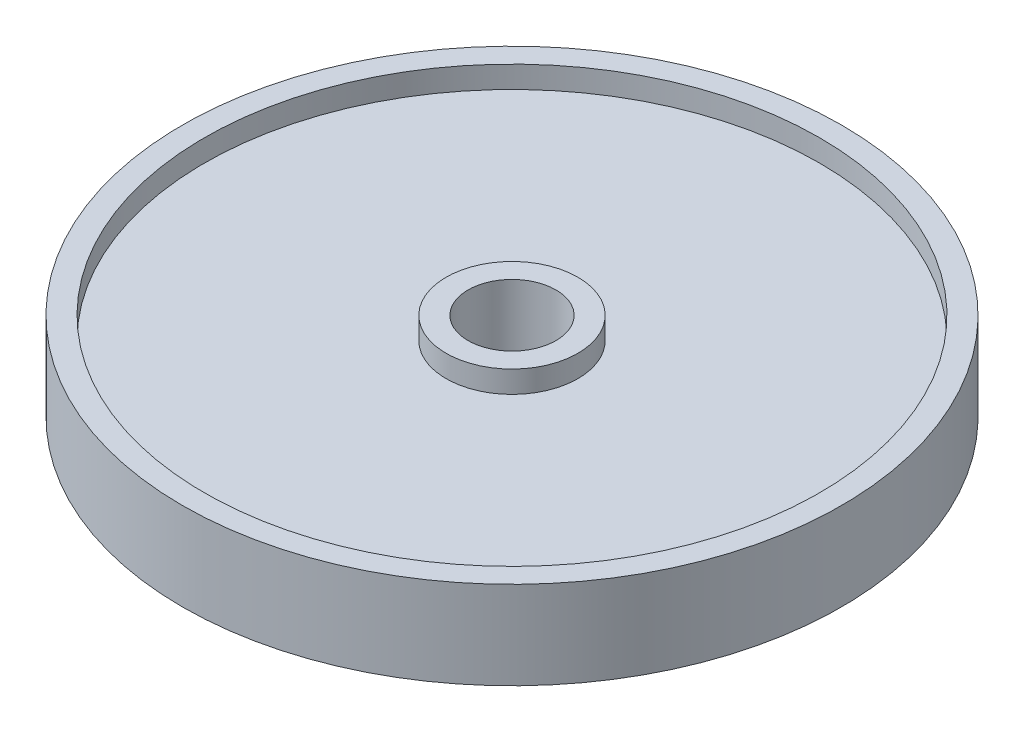
ISO-10303-21;
HEADER;
FILE_DESCRIPTION(('STEP AP214'),'2;1');
FILE_NAME('part.step','',(''),(''),'','','');
FILE_SCHEMA(('AUTOMOTIVE_DESIGN { 1 0 10303 214 1 1 1 1 }'));
ENDSEC;
DATA;
#1=APPLICATION_CONTEXT('core data for automotive mechanical design processes');
#2=APPLICATION_PROTOCOL_DEFINITION('international standard','automotive_design',2000,#1);
#3=PRODUCT_CONTEXT('',#1,'mechanical');
#4=PRODUCT('Part','Part','',(#3));
#5=PRODUCT_RELATED_PRODUCT_CATEGORY('part','',(#4));
#6=PRODUCT_DEFINITION_FORMATION('','',#4);
#7=PRODUCT_DEFINITION_CONTEXT('part definition',#1,'design');
#8=PRODUCT_DEFINITION('design','',#6,#7);
#9=PRODUCT_DEFINITION_SHAPE('','',#8);
#10=(LENGTH_UNIT() NAMED_UNIT(*) SI_UNIT(.MILLI.,.METRE.));
#11=(NAMED_UNIT(*) PLANE_ANGLE_UNIT() SI_UNIT($,.RADIAN.));
#12=(NAMED_UNIT(*) SI_UNIT($,.STERADIAN.) SOLID_ANGLE_UNIT());
#13=UNCERTAINTY_MEASURE_WITH_UNIT(LENGTH_MEASURE(1.E-05),#10,'distance_accuracy_value','');
#14=(GEOMETRIC_REPRESENTATION_CONTEXT(3) GLOBAL_UNCERTAINTY_ASSIGNED_CONTEXT((#13)) GLOBAL_UNIT_ASSIGNED_CONTEXT((#10,
#11,#12)) REPRESENTATION_CONTEXT('',''));
#15=CARTESIAN_POINT('',(0.,0.,0.));
#16=DIRECTION('',(0.,0.,1.));
#17=DIRECTION('',(1.,0.,0.));
#18=AXIS2_PLACEMENT_3D('',#15,#16,#17);
#19=CARTESIAN_POINT('',(0.,-9.48222589616056,0.));
#20=DIRECTION('',(0.,-1.,0.));
#21=DIRECTION('',(0.,0.,-1.));
#22=AXIS2_PLACEMENT_3D('',#19,#20,#21);
#23=CYLINDRICAL_SURFACE('',#22,5.);
#24=CARTESIAN_POINT('',(0.,-5.,0.));
#25=DIRECTION('',(0.,-1.,0.));
#26=DIRECTION('',(0.,0.,-1.));
#27=AXIS2_PLACEMENT_3D('',#24,#25,#26);
#28=CIRCLE('',#27,5.);
#29=CARTESIAN_POINT('',(0.,-5.,-5.));
#30=VERTEX_POINT('',#29);
#31=EDGE_CURVE('E10',#30,#30,#28,.T.);
#32=ORIENTED_EDGE('',*,*,#31,.T.);
#33=EDGE_LOOP('',(#32));
#34=FACE_BOUND('',#33,.T.);
#35=CARTESIAN_POINT('',(0.,5.,0.));
#36=DIRECTION('',(0.,-1.,0.));
#37=DIRECTION('',(0.,0.,-1.));
#38=AXIS2_PLACEMENT_3D('',#35,#36,#37);
#39=CIRCLE('',#38,5.);
#40=CARTESIAN_POINT('',(0.,5.,-5.));
#41=VERTEX_POINT('',#40);
#42=EDGE_CURVE('E70',#41,#41,#39,.T.);
#43=ORIENTED_EDGE('',*,*,#42,.F.);
#44=EDGE_LOOP('',(#43));
#45=FACE_BOUND('',#44,.T.);
#46=ADVANCED_FACE('F30',(#34,#45),#23,.F.);
#47=CARTESIAN_POINT('',(5.,-5.,0.));
#48=DIRECTION('',(0.,-1.,0.));
#49=DIRECTION('',(0.,0.,-1.));
#50=AXIS2_PLACEMENT_3D('',#47,#48,#49);
#51=PLANE('',#50);
#52=CARTESIAN_POINT('',(0.,-5.,0.));
#53=DIRECTION('',(0.,-1.,0.));
#54=DIRECTION('',(0.,0.,-1.));
#55=AXIS2_PLACEMENT_3D('',#52,#53,#54);
#56=CIRCLE('',#55,7.5);
#57=CARTESIAN_POINT('',(0.,-5.,-7.5));
#58=VERTEX_POINT('',#57);
#59=EDGE_CURVE('E36',#58,#58,#56,.T.);
#60=ORIENTED_EDGE('',*,*,#59,.T.);
#61=EDGE_LOOP('',(#60));
#62=FACE_BOUND('',#61,.T.);
#63=ORIENTED_EDGE('',*,*,#31,.F.);
#64=EDGE_LOOP('',(#63));
#65=FACE_BOUND('',#64,.T.);
#66=ADVANCED_FACE('F78',(#62,#65),#51,.T.);
#67=CARTESIAN_POINT('',(0.,-9.48222589616056,0.));
#68=DIRECTION('',(0.,-1.,0.));
#69=DIRECTION('',(0.,0.,-1.));
#70=AXIS2_PLACEMENT_3D('',#67,#68,#69);
#71=CYLINDRICAL_SURFACE('',#70,7.5);
#72=CARTESIAN_POINT('',(0.,-2.5,0.));
#73=DIRECTION('',(0.,-1.,0.));
#74=DIRECTION('',(0.,0.,-1.));
#75=AXIS2_PLACEMENT_3D('',#72,#73,#74);
#76=CIRCLE('',#75,7.5);
#77=CARTESIAN_POINT('',(0.,-2.5,-7.5));
#78=VERTEX_POINT('',#77);
#79=EDGE_CURVE('E40',#78,#78,#76,.T.);
#80=ORIENTED_EDGE('',*,*,#79,.T.);
#81=EDGE_LOOP('',(#80));
#82=FACE_BOUND('',#81,.T.);
#83=ORIENTED_EDGE('',*,*,#59,.F.);
#84=EDGE_LOOP('',(#83));
#85=FACE_BOUND('',#84,.T.);
#86=ADVANCED_FACE('F82',(#82,#85),#71,.T.);
#87=CARTESIAN_POINT('',(7.5,-2.5,0.));
#88=DIRECTION('',(0.,-1.,0.));
#89=DIRECTION('',(0.,0.,-1.));
#90=AXIS2_PLACEMENT_3D('',#87,#88,#89);
#91=PLANE('',#90);
#92=CARTESIAN_POINT('',(0.,-2.5,0.));
#93=DIRECTION('',(0.,-1.,0.));
#94=DIRECTION('',(0.,0.,-1.));
#95=AXIS2_PLACEMENT_3D('',#92,#93,#94);
#96=CIRCLE('',#95,35.);
#97=CARTESIAN_POINT('',(0.,-2.5,-35.));
#98=VERTEX_POINT('',#97);
#99=EDGE_CURVE('E44',#98,#98,#96,.T.);
#100=ORIENTED_EDGE('',*,*,#99,.T.);
#101=EDGE_LOOP('',(#100));
#102=FACE_BOUND('',#101,.T.);
#103=ORIENTED_EDGE('',*,*,#79,.F.);
#104=EDGE_LOOP('',(#103));
#105=FACE_BOUND('',#104,.T.);
#106=ADVANCED_FACE('F86',(#102,#105),#91,.T.);
#107=CARTESIAN_POINT('',(0.,-9.48222589616056,0.));
#108=DIRECTION('',(0.,-1.,0.));
#109=DIRECTION('',(0.,0.,-1.));
#110=AXIS2_PLACEMENT_3D('',#107,#108,#109);
#111=CYLINDRICAL_SURFACE('',#110,35.);
#112=CARTESIAN_POINT('',(0.,-5.,0.));
#113=DIRECTION('',(0.,-1.,0.));
#114=DIRECTION('',(0.,0.,-1.));
#115=AXIS2_PLACEMENT_3D('',#112,#113,#114);
#116=CIRCLE('',#115,35.);
#117=CARTESIAN_POINT('',(0.,-5.,-35.));
#118=VERTEX_POINT('',#117);
#119=EDGE_CURVE('E49',#118,#118,#116,.T.);
#120=ORIENTED_EDGE('',*,*,#119,.T.);
#121=EDGE_LOOP('',(#120));
#122=FACE_BOUND('',#121,.T.);
#123=ORIENTED_EDGE('',*,*,#99,.F.);
#124=EDGE_LOOP('',(#123));
#125=FACE_BOUND('',#124,.T.);
#126=ADVANCED_FACE('F93',(#122,#125),#111,.F.);
#127=CARTESIAN_POINT('',(35.,-5.,0.));
#128=DIRECTION('',(0.,-1.,0.));
#129=DIRECTION('',(0.,0.,-1.));
#130=AXIS2_PLACEMENT_3D('',#127,#128,#129);
#131=PLANE('',#130);
#132=CARTESIAN_POINT('',(0.,-5.,0.));
#133=DIRECTION('',(0.,-1.,0.));
#134=DIRECTION('',(0.,0.,-1.));
#135=AXIS2_PLACEMENT_3D('',#132,#133,#134);
#136=CIRCLE('',#135,37.5);
#137=CARTESIAN_POINT('',(0.,-5.,-37.5));
#138=VERTEX_POINT('',#137);
#139=EDGE_CURVE('E52',#138,#138,#136,.T.);
#140=ORIENTED_EDGE('',*,*,#139,.T.);
#141=EDGE_LOOP('',(#140));
#142=FACE_BOUND('',#141,.T.);
#143=ORIENTED_EDGE('',*,*,#119,.F.);
#144=EDGE_LOOP('',(#143));
#145=FACE_BOUND('',#144,.T.);
#146=ADVANCED_FACE('F97',(#142,#145),#131,.T.);
#147=CARTESIAN_POINT('',(0.,-9.48222589616056,0.));
#148=DIRECTION('',(0.,-1.,0.));
#149=DIRECTION('',(0.,0.,-1.));
#150=AXIS2_PLACEMENT_3D('',#147,#148,#149);
#151=CYLINDRICAL_SURFACE('',#150,37.5);
#152=CARTESIAN_POINT('',(0.,5.,0.));
#153=DIRECTION('',(0.,-1.,0.));
#154=DIRECTION('',(0.,0.,-1.));
#155=AXIS2_PLACEMENT_3D('',#152,#153,#154);
#156=CIRCLE('',#155,37.5);
#157=CARTESIAN_POINT('',(0.,5.,-37.5));
#158=VERTEX_POINT('',#157);
#159=EDGE_CURVE('E55',#158,#158,#156,.T.);
#160=ORIENTED_EDGE('',*,*,#159,.T.);
#161=EDGE_LOOP('',(#160));
#162=FACE_BOUND('',#161,.T.);
#163=ORIENTED_EDGE('',*,*,#139,.F.);
#164=EDGE_LOOP('',(#163));
#165=FACE_BOUND('',#164,.T.);
#166=ADVANCED_FACE('F101',(#162,#165),#151,.T.);
#167=CARTESIAN_POINT('',(35.,5.,0.));
#168=DIRECTION('',(0.,1.,0.));
#169=DIRECTION('',(0.,0.,1.));
#170=AXIS2_PLACEMENT_3D('',#167,#168,#169);
#171=PLANE('',#170);
#172=CARTESIAN_POINT('',(0.,5.,0.));
#173=DIRECTION('',(0.,-1.,0.));
#174=DIRECTION('',(0.,0.,-1.));
#175=AXIS2_PLACEMENT_3D('',#172,#173,#174);
#176=CIRCLE('',#175,35.);
#177=CARTESIAN_POINT('',(0.,5.,-35.));
#178=VERTEX_POINT('',#177);
#179=EDGE_CURVE('E58',#178,#178,#176,.T.);
#180=ORIENTED_EDGE('',*,*,#179,.T.);
#181=EDGE_LOOP('',(#180));
#182=FACE_BOUND('',#181,.T.);
#183=ORIENTED_EDGE('',*,*,#159,.F.);
#184=EDGE_LOOP('',(#183));
#185=FACE_BOUND('',#184,.T.);
#186=ADVANCED_FACE('F105',(#182,#185),#171,.T.);
#187=CARTESIAN_POINT('',(0.,-9.48222589616056,0.));
#188=DIRECTION('',(0.,-1.,0.));
#189=DIRECTION('',(0.,0.,-1.));
#190=AXIS2_PLACEMENT_3D('',#187,#188,#189);
#191=CYLINDRICAL_SURFACE('',#190,35.);
#192=CARTESIAN_POINT('',(0.,2.5,0.));
#193=DIRECTION('',(0.,-1.,0.));
#194=DIRECTION('',(0.,0.,-1.));
#195=AXIS2_PLACEMENT_3D('',#192,#193,#194);
#196=CIRCLE('',#195,35.);
#197=CARTESIAN_POINT('',(0.,2.5,-35.));
#198=VERTEX_POINT('',#197);
#199=EDGE_CURVE('E61',#198,#198,#196,.T.);
#200=ORIENTED_EDGE('',*,*,#199,.T.);
#201=EDGE_LOOP('',(#200));
#202=FACE_BOUND('',#201,.T.);
#203=ORIENTED_EDGE('',*,*,#179,.F.);
#204=EDGE_LOOP('',(#203));
#205=FACE_BOUND('',#204,.T.);
#206=ADVANCED_FACE('F109',(#202,#205),#191,.F.);
#207=CARTESIAN_POINT('',(7.5,2.5,0.));
#208=DIRECTION('',(0.,1.,0.));
#209=DIRECTION('',(0.,0.,1.));
#210=AXIS2_PLACEMENT_3D('',#207,#208,#209);
#211=PLANE('',#210);
#212=CARTESIAN_POINT('',(0.,2.5,0.));
#213=DIRECTION('',(0.,-1.,0.));
#214=DIRECTION('',(0.,0.,-1.));
#215=AXIS2_PLACEMENT_3D('',#212,#213,#214);
#216=CIRCLE('',#215,7.5);
#217=CARTESIAN_POINT('',(0.,2.5,-7.5));
#218=VERTEX_POINT('',#217);
#219=EDGE_CURVE('E64',#218,#218,#216,.T.);
#220=ORIENTED_EDGE('',*,*,#219,.T.);
#221=EDGE_LOOP('',(#220));
#222=FACE_BOUND('',#221,.T.);
#223=ORIENTED_EDGE('',*,*,#199,.F.);
#224=EDGE_LOOP('',(#223));
#225=FACE_BOUND('',#224,.T.);
#226=ADVANCED_FACE('F113',(#222,#225),#211,.T.);
#227=CARTESIAN_POINT('',(0.,-9.48222589616056,0.));
#228=DIRECTION('',(0.,-1.,0.));
#229=DIRECTION('',(0.,0.,-1.));
#230=AXIS2_PLACEMENT_3D('',#227,#228,#229);
#231=CYLINDRICAL_SURFACE('',#230,7.5);
#232=CARTESIAN_POINT('',(0.,5.,0.));
#233=DIRECTION('',(0.,-1.,0.));
#234=DIRECTION('',(0.,0.,-1.));
#235=AXIS2_PLACEMENT_3D('',#232,#233,#234);
#236=CIRCLE('',#235,7.5);
#237=CARTESIAN_POINT('',(0.,5.,-7.5));
#238=VERTEX_POINT('',#237);
#239=EDGE_CURVE('E67',#238,#238,#236,.T.);
#240=ORIENTED_EDGE('',*,*,#239,.T.);
#241=EDGE_LOOP('',(#240));
#242=FACE_BOUND('',#241,.T.);
#243=ORIENTED_EDGE('',*,*,#219,.F.);
#244=EDGE_LOOP('',(#243));
#245=FACE_BOUND('',#244,.T.);
#246=ADVANCED_FACE('F117',(#242,#245),#231,.T.);
#247=CARTESIAN_POINT('',(5.,5.,0.));
#248=DIRECTION('',(0.,1.,0.));
#249=DIRECTION('',(0.,0.,1.));
#250=AXIS2_PLACEMENT_3D('',#247,#248,#249);
#251=PLANE('',#250);
#252=ORIENTED_EDGE('',*,*,#42,.T.);
#253=EDGE_LOOP('',(#252));
#254=FACE_BOUND('',#253,.T.);
#255=ORIENTED_EDGE('',*,*,#239,.F.);
#256=EDGE_LOOP('',(#255));
#257=FACE_BOUND('',#256,.T.);
#258=ADVANCED_FACE('F74',(#254,#257),#251,.T.);
#259=CLOSED_SHELL('',(#46,#66,#86,#106,#126,#146,#166,#186,#206,#226,#246,#258));
#260=MANIFOLD_SOLID_BREP('B2',#259);
#261=ADVANCED_BREP_SHAPE_REPRESENTATION('',(#18,#260),#14);
#262=SHAPE_DEFINITION_REPRESENTATION(#9,#261);
ENDSEC;
END-ISO-10303-21;
